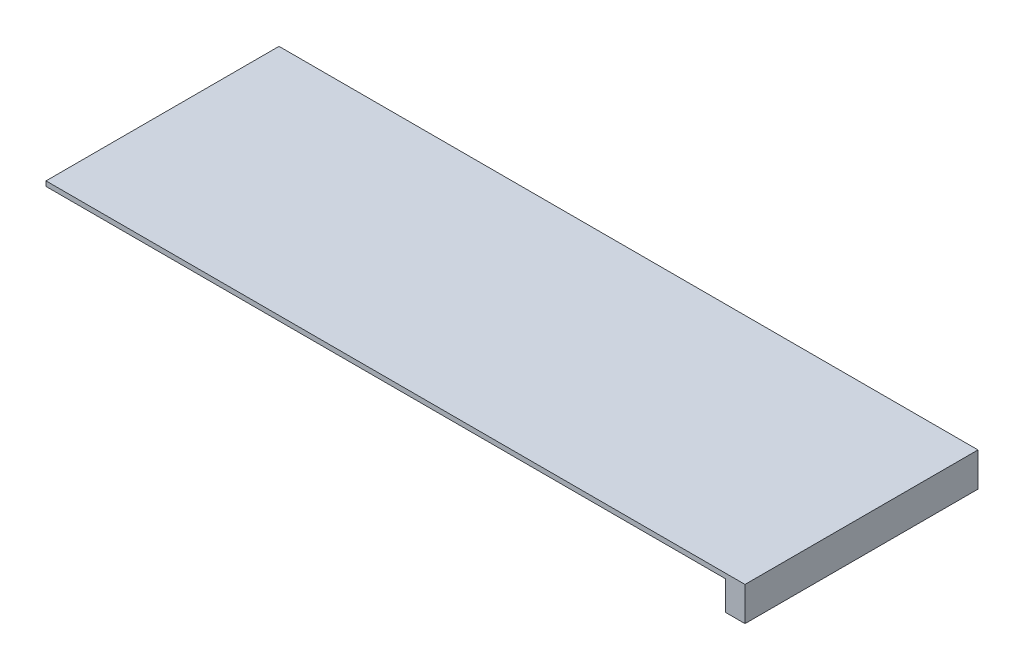
ISO-10303-21;
HEADER;
FILE_DESCRIPTION(('STEP AP214'),'2;1');
FILE_NAME('part.step','',(''),(''),'','','');
FILE_SCHEMA(('AUTOMOTIVE_DESIGN { 1 0 10303 214 1 1 1 1 }'));
ENDSEC;
DATA;
#1=APPLICATION_CONTEXT('core data for automotive mechanical design processes');
#2=APPLICATION_PROTOCOL_DEFINITION('international standard','automotive_design',2000,#1);
#3=PRODUCT_CONTEXT('',#1,'mechanical');
#4=PRODUCT('Part','Part','',(#3));
#5=PRODUCT_RELATED_PRODUCT_CATEGORY('part','',(#4));
#6=PRODUCT_DEFINITION_FORMATION('','',#4);
#7=PRODUCT_DEFINITION_CONTEXT('part definition',#1,'design');
#8=PRODUCT_DEFINITION('design','',#6,#7);
#9=PRODUCT_DEFINITION_SHAPE('','',#8);
#10=(LENGTH_UNIT() NAMED_UNIT(*) SI_UNIT(.MILLI.,.METRE.));
#11=(NAMED_UNIT(*) PLANE_ANGLE_UNIT() SI_UNIT($,.RADIAN.));
#12=(NAMED_UNIT(*) SI_UNIT($,.STERADIAN.) SOLID_ANGLE_UNIT());
#13=UNCERTAINTY_MEASURE_WITH_UNIT(LENGTH_MEASURE(1.E-05),#10,'distance_accuracy_value','');
#14=(GEOMETRIC_REPRESENTATION_CONTEXT(3) GLOBAL_UNCERTAINTY_ASSIGNED_CONTEXT((#13)) GLOBAL_UNIT_ASSIGNED_CONTEXT((#10,
#11,#12)) REPRESENTATION_CONTEXT('',''));
#15=CARTESIAN_POINT('',(0.,0.,0.));
#16=DIRECTION('',(0.,0.,1.));
#17=DIRECTION('',(1.,0.,0.));
#18=AXIS2_PLACEMENT_3D('',#15,#16,#17);
#19=CARTESIAN_POINT('',(-12.7,-19.05,0.));
#20=DIRECTION('',(1.,0.,0.));
#21=DIRECTION('',(0.,0.,-1.));
#22=AXIS2_PLACEMENT_3D('',#19,#20,#21);
#23=PLANE('',#22);
#24=DIRECTION('',(0.,-1.,0.));
#25=VECTOR('',#24,1.);
#26=CARTESIAN_POINT('',(-12.7,6.35,-19.05));
#27=LINE('',#26,#25);
#28=CARTESIAN_POINT('',(-12.7,0.,-19.05));
#29=VERTEX_POINT('',#28);
#30=CARTESIAN_POINT('',(-12.7,-19.05,-19.05));
#31=VERTEX_POINT('',#30);
#32=EDGE_CURVE('E124',#29,#31,#27,.T.);
#33=ORIENTED_EDGE('',*,*,#32,.F.);
#34=DIRECTION('',(0.,0.,1.));
#35=VECTOR('',#34,1.);
#36=CARTESIAN_POINT('',(-12.7,0.,38.0999999999999));
#37=LINE('',#36,#35);
#38=CARTESIAN_POINT('',(-12.7,0.,38.0999999999999));
#39=VERTEX_POINT('',#38);
#40=EDGE_CURVE('E205',#29,#39,#37,.T.);
#41=ORIENTED_EDGE('',*,*,#40,.T.);
#42=DIRECTION('',(0.,-1.,0.));
#43=VECTOR('',#42,1.);
#44=CARTESIAN_POINT('',(-12.7,3.175,38.0999999999999));
#45=LINE('',#44,#43);
#46=CARTESIAN_POINT('',(-12.7,3.175,38.0999999999999));
#47=VERTEX_POINT('',#46);
#48=EDGE_CURVE('E194',#47,#39,#45,.T.);
#49=ORIENTED_EDGE('',*,*,#48,.F.);
#50=DIRECTION('',(0.,0.,1.));
#51=VECTOR('',#50,1.);
#52=CARTESIAN_POINT('',(-12.7,3.175,38.0999999999999));
#53=LINE('',#52,#51);
#54=CARTESIAN_POINT('',(-12.7,3.175,-114.3));
#55=VERTEX_POINT('',#54);
#56=EDGE_CURVE('E192',#55,#47,#53,.T.);
#57=ORIENTED_EDGE('',*,*,#56,.F.);
#58=DIRECTION('',(0.,1.,0.));
#59=VECTOR('',#58,1.);
#60=CARTESIAN_POINT('',(-12.7,-19.05,-114.3));
#61=LINE('',#60,#59);
#62=CARTESIAN_POINT('',(-12.7,-19.05,-114.3));
#63=VERTEX_POINT('',#62);
#64=EDGE_CURVE('E131',#63,#55,#61,.T.);
#65=ORIENTED_EDGE('',*,*,#64,.F.);
#66=DIRECTION('',(0.,0.,-1.));
#67=VECTOR('',#66,1.);
#68=CARTESIAN_POINT('',(-12.7,-19.05,0.));
#69=LINE('',#68,#67);
#70=EDGE_CURVE('E80',#31,#63,#69,.T.);
#71=ORIENTED_EDGE('',*,*,#70,.F.);
#72=EDGE_LOOP('',(#33,#41,#49,#57,#65,#71));
#73=FACE_BOUND('',#72,.T.);
#74=ADVANCED_FACE('F36',(#73),#23,.F.);
#75=CARTESIAN_POINT('',(0.,-19.05,0.));
#76=DIRECTION('',(0.,-1.,0.));
#77=DIRECTION('',(0.,0.,-1.));
#78=AXIS2_PLACEMENT_3D('',#75,#76,#77);
#79=PLANE('',#78);
#80=DIRECTION('',(1.,0.,0.));
#81=VECTOR('',#80,1.);
#82=CARTESIAN_POINT('',(0.,-19.05,-19.05));
#83=LINE('',#82,#81);
#84=CARTESIAN_POINT('',(57.15,-19.05,-19.05));
#85=VERTEX_POINT('',#84);
#86=EDGE_CURVE('E116',#31,#85,#83,.T.);
#87=ORIENTED_EDGE('',*,*,#86,.F.);
#88=ORIENTED_EDGE('',*,*,#70,.T.);
#89=DIRECTION('',(1.,0.,0.));
#90=VECTOR('',#89,1.);
#91=CARTESIAN_POINT('',(0.,-19.05,-114.3));
#92=LINE('',#91,#90);
#93=CARTESIAN_POINT('',(444.5,-19.05,-114.3));
#94=VERTEX_POINT('',#93);
#95=EDGE_CURVE('E164',#63,#94,#92,.T.);
#96=ORIENTED_EDGE('',*,*,#95,.T.);
#97=DIRECTION('',(0.,0.,1.));
#98=VECTOR('',#97,1.);
#99=CARTESIAN_POINT('',(444.5,-19.05,0.));
#100=LINE('',#99,#98);
#101=CARTESIAN_POINT('',(444.5,-19.05,38.0999999999999));
#102=VERTEX_POINT('',#101);
#103=EDGE_CURVE('E111',#94,#102,#100,.T.);
#104=ORIENTED_EDGE('',*,*,#103,.T.);
#105=DIRECTION('',(1.,0.,0.));
#106=VECTOR('',#105,1.);
#107=CARTESIAN_POINT('',(0.,-19.05,38.0999999999999));
#108=LINE('',#107,#106);
#109=CARTESIAN_POINT('',(431.8,-19.05,38.0999999999999));
#110=VERTEX_POINT('',#109);
#111=EDGE_CURVE('E150',#110,#102,#108,.T.);
#112=ORIENTED_EDGE('',*,*,#111,.F.);
#113=DIRECTION('',(0.,0.,1.));
#114=VECTOR('',#113,1.);
#115=CARTESIAN_POINT('',(431.8,-19.05,0.));
#116=LINE('',#115,#114);
#117=CARTESIAN_POINT('',(431.8,-19.05,12.6999999999999));
#118=VERTEX_POINT('',#117);
#119=EDGE_CURVE('E110',#118,#110,#116,.T.);
#120=ORIENTED_EDGE('',*,*,#119,.F.);
#121=DIRECTION('',(0.786318338822423,0.,0.617821551931904));
#122=VECTOR('',#121,1.);
#123=CARTESIAN_POINT('',(158.649842271293,-19.05,-201.917981072555));
#124=LINE('',#123,#122);
#125=CARTESIAN_POINT('',(342.9,-19.05,-57.15));
#126=VERTEX_POINT('',#125);
#127=EDGE_CURVE('E97',#126,#118,#124,.T.);
#128=ORIENTED_EDGE('',*,*,#127,.F.);
#129=DIRECTION('',(1.,0.,0.));
#130=VECTOR('',#129,1.);
#131=CARTESIAN_POINT('',(0.,-19.05,-57.15));
#132=LINE('',#131,#130);
#133=CARTESIAN_POINT('',(88.9,-19.05,-57.15));
#134=VERTEX_POINT('',#133);
#135=EDGE_CURVE('E107',#134,#126,#132,.T.);
#136=ORIENTED_EDGE('',*,*,#135,.F.);
#137=DIRECTION('',(0.64018439966448,0.,-0.768221279597376));
#138=VECTOR('',#137,1.);
#139=CARTESIAN_POINT('',(24.3590163934426,-19.05,20.2991803278689));
#140=LINE('',#139,#138);
#141=EDGE_CURVE('E114',#85,#134,#140,.T.);
#142=ORIENTED_EDGE('',*,*,#141,.F.);
#143=EDGE_LOOP('',(#87,#88,#96,#104,#112,#120,#128,#136,#142));
#144=FACE_BOUND('',#143,.T.);
#145=ADVANCED_FACE('F106',(#144),#79,.T.);
#146=CARTESIAN_POINT('',(158.649842271293,-19.05,-201.917981072555));
#147=DIRECTION('',(-0.617821551931903,0.,0.786318338822423));
#148=DIRECTION('',(0.786318338822423,0.,0.617821551931904));
#149=AXIS2_PLACEMENT_3D('',#146,#147,#148);
#150=PLANE('',#149);
#151=DIRECTION('',(0.786318338822423,0.,0.617821551931904));
#152=VECTOR('',#151,1.);
#153=CARTESIAN_POINT('',(158.649842271293,0.,-201.917981072555));
#154=LINE('',#153,#152);
#155=CARTESIAN_POINT('',(342.9,0.,-57.15));
#156=VERTEX_POINT('',#155);
#157=CARTESIAN_POINT('',(431.8,0.,12.6999999999999));
#158=VERTEX_POINT('',#157);
#159=EDGE_CURVE('E99',#156,#158,#154,.T.);
#160=ORIENTED_EDGE('',*,*,#159,.F.);
#161=DIRECTION('',(0.,1.,0.));
#162=VECTOR('',#161,1.);
#163=CARTESIAN_POINT('',(342.9,-19.05,-57.15));
#164=LINE('',#163,#162);
#165=EDGE_CURVE('E92',#126,#156,#164,.T.);
#166=ORIENTED_EDGE('',*,*,#165,.F.);
#167=ORIENTED_EDGE('',*,*,#127,.T.);
#168=DIRECTION('',(0.,1.,0.));
#169=VECTOR('',#168,1.);
#170=CARTESIAN_POINT('',(431.8,-19.05,12.7));
#171=LINE('',#170,#169);
#172=EDGE_CURVE('E46',#118,#158,#171,.T.);
#173=ORIENTED_EDGE('',*,*,#172,.T.);
#174=EDGE_LOOP('',(#160,#166,#167,#173));
#175=FACE_BOUND('',#174,.T.);
#176=ADVANCED_FACE('F94',(#175),#150,.T.);
#177=CARTESIAN_POINT('',(0.,-19.05,-57.15));
#178=DIRECTION('',(0.,0.,1.));
#179=DIRECTION('',(1.,0.,0.));
#180=AXIS2_PLACEMENT_3D('',#177,#178,#179);
#181=PLANE('',#180);
#182=DIRECTION('',(1.,0.,0.));
#183=VECTOR('',#182,1.);
#184=CARTESIAN_POINT('',(0.,0.,-57.15));
#185=LINE('',#184,#183);
#186=CARTESIAN_POINT('',(88.9,0.,-57.15));
#187=VERTEX_POINT('',#186);
#188=EDGE_CURVE('E123',#187,#156,#185,.T.);
#189=ORIENTED_EDGE('',*,*,#188,.F.);
#190=DIRECTION('',(0.,1.,0.));
#191=VECTOR('',#190,1.);
#192=CARTESIAN_POINT('',(88.9,-19.05,-57.15));
#193=LINE('',#192,#191);
#194=EDGE_CURVE('E67',#134,#187,#193,.T.);
#195=ORIENTED_EDGE('',*,*,#194,.F.);
#196=ORIENTED_EDGE('',*,*,#135,.T.);
#197=ORIENTED_EDGE('',*,*,#165,.T.);
#198=EDGE_LOOP('',(#189,#195,#196,#197));
#199=FACE_BOUND('',#198,.T.);
#200=ADVANCED_FACE('F113',(#199),#181,.T.);
#201=CARTESIAN_POINT('',(24.3590163934426,-19.05,20.2991803278689));
#202=DIRECTION('',(0.768221279597376,0.,0.64018439966448));
#203=DIRECTION('',(0.64018439966448,0.,-0.768221279597376));
#204=AXIS2_PLACEMENT_3D('',#201,#202,#203);
#205=PLANE('',#204);
#206=DIRECTION('',(0.64018439966448,0.,-0.768221279597376));
#207=VECTOR('',#206,1.);
#208=CARTESIAN_POINT('',(24.3590163934426,0.,20.2991803278689));
#209=LINE('',#208,#207);
#210=CARTESIAN_POINT('',(57.15,0.,-19.05));
#211=VERTEX_POINT('',#210);
#212=EDGE_CURVE('E126',#211,#187,#209,.T.);
#213=ORIENTED_EDGE('',*,*,#212,.F.);
#214=DIRECTION('',(0.,1.,0.));
#215=VECTOR('',#214,1.);
#216=CARTESIAN_POINT('',(57.15,-19.05,-19.05));
#217=LINE('',#216,#215);
#218=EDGE_CURVE('E55',#85,#211,#217,.T.);
#219=ORIENTED_EDGE('',*,*,#218,.F.);
#220=ORIENTED_EDGE('',*,*,#141,.T.);
#221=ORIENTED_EDGE('',*,*,#194,.T.);
#222=EDGE_LOOP('',(#213,#219,#220,#221));
#223=FACE_BOUND('',#222,.T.);
#224=ADVANCED_FACE('F229',(#223),#205,.T.);
#225=CARTESIAN_POINT('',(0.,-19.05,-19.05));
#226=DIRECTION('',(0.,0.,1.));
#227=DIRECTION('',(1.,0.,0.));
#228=AXIS2_PLACEMENT_3D('',#225,#226,#227);
#229=PLANE('',#228);
#230=DIRECTION('',(1.,0.,0.));
#231=VECTOR('',#230,1.);
#232=CARTESIAN_POINT('',(0.,0.,-19.05));
#233=LINE('',#232,#231);
#234=EDGE_CURVE('E129',#29,#211,#233,.T.);
#235=ORIENTED_EDGE('',*,*,#234,.F.);
#236=ORIENTED_EDGE('',*,*,#32,.T.);
#237=ORIENTED_EDGE('',*,*,#86,.T.);
#238=ORIENTED_EDGE('',*,*,#218,.T.);
#239=EDGE_LOOP('',(#235,#236,#237,#238));
#240=FACE_BOUND('',#239,.T.);
#241=ADVANCED_FACE('F155',(#240),#229,.T.);
#242=CARTESIAN_POINT('',(0.,-19.05,38.0999999999999));
#243=DIRECTION('',(0.,0.,1.));
#244=DIRECTION('',(1.,0.,0.));
#245=AXIS2_PLACEMENT_3D('',#242,#243,#244);
#246=PLANE('',#245);
#247=DIRECTION('',(0.,-1.,0.));
#248=VECTOR('',#247,1.);
#249=CARTESIAN_POINT('',(431.8,6.35,38.0999999999999));
#250=LINE('',#249,#248);
#251=CARTESIAN_POINT('',(431.8,0.,38.0999999999999));
#252=VERTEX_POINT('',#251);
#253=EDGE_CURVE('E143',#252,#110,#250,.T.);
#254=ORIENTED_EDGE('',*,*,#253,.T.);
#255=ORIENTED_EDGE('',*,*,#111,.T.);
#256=DIRECTION('',(0.,1.,0.));
#257=VECTOR('',#256,1.);
#258=CARTESIAN_POINT('',(444.5,-19.05,38.0999999999999));
#259=LINE('',#258,#257);
#260=CARTESIAN_POINT('',(444.5,3.175,38.0999999999999));
#261=VERTEX_POINT('',#260);
#262=EDGE_CURVE('E121',#102,#261,#259,.T.);
#263=ORIENTED_EDGE('',*,*,#262,.T.);
#264=DIRECTION('',(1.,0.,0.));
#265=VECTOR('',#264,1.);
#266=CARTESIAN_POINT('',(444.5,3.175,38.0999999999999));
#267=LINE('',#266,#265);
#268=EDGE_CURVE('E184',#47,#261,#267,.T.);
#269=ORIENTED_EDGE('',*,*,#268,.F.);
#270=ORIENTED_EDGE('',*,*,#48,.T.);
#271=DIRECTION('',(1.,0.,0.));
#272=VECTOR('',#271,1.);
#273=CARTESIAN_POINT('',(444.5,0.,38.0999999999999));
#274=LINE('',#273,#272);
#275=EDGE_CURVE('E207',#39,#252,#274,.T.);
#276=ORIENTED_EDGE('',*,*,#275,.T.);
#277=EDGE_LOOP('',(#254,#255,#263,#269,#270,#276));
#278=FACE_BOUND('',#277,.T.);
#279=ADVANCED_FACE('F38',(#278),#246,.T.);
#280=CARTESIAN_POINT('',(0.,-19.05,-114.3));
#281=DIRECTION('',(0.,0.,1.));
#282=DIRECTION('',(1.,0.,0.));
#283=AXIS2_PLACEMENT_3D('',#280,#281,#282);
#284=PLANE('',#283);
#285=ORIENTED_EDGE('',*,*,#64,.T.);
#286=DIRECTION('',(-1.,0.,0.));
#287=VECTOR('',#286,1.);
#288=CARTESIAN_POINT('',(444.5,3.175,-114.3));
#289=LINE('',#288,#287);
#290=CARTESIAN_POINT('',(444.5,3.175,-114.3));
#291=VERTEX_POINT('',#290);
#292=EDGE_CURVE('E197',#291,#55,#289,.T.);
#293=ORIENTED_EDGE('',*,*,#292,.F.);
#294=DIRECTION('',(0.,1.,0.));
#295=VECTOR('',#294,1.);
#296=CARTESIAN_POINT('',(444.5,-19.05,-114.3));
#297=LINE('',#296,#295);
#298=EDGE_CURVE('E136',#94,#291,#297,.T.);
#299=ORIENTED_EDGE('',*,*,#298,.F.);
#300=ORIENTED_EDGE('',*,*,#95,.F.);
#301=EDGE_LOOP('',(#285,#293,#299,#300));
#302=FACE_BOUND('',#301,.T.);
#303=ADVANCED_FACE('F244',(#302),#284,.F.);
#304=CARTESIAN_POINT('',(444.5,-19.05,0.));
#305=DIRECTION('',(-1.,0.,0.));
#306=DIRECTION('',(0.,0.,1.));
#307=AXIS2_PLACEMENT_3D('',#304,#305,#306);
#308=PLANE('',#307);
#309=ORIENTED_EDGE('',*,*,#298,.T.);
#310=DIRECTION('',(0.,0.,-1.));
#311=VECTOR('',#310,1.);
#312=CARTESIAN_POINT('',(444.5,3.175,38.0999999999999));
#313=LINE('',#312,#311);
#314=EDGE_CURVE('E178',#261,#291,#313,.T.);
#315=ORIENTED_EDGE('',*,*,#314,.F.);
#316=ORIENTED_EDGE('',*,*,#262,.F.);
#317=ORIENTED_EDGE('',*,*,#103,.F.);
#318=EDGE_LOOP('',(#309,#315,#316,#317));
#319=FACE_BOUND('',#318,.T.);
#320=ADVANCED_FACE('F175',(#319),#308,.F.);
#321=CARTESIAN_POINT('',(431.8,6.35,0.));
#322=DIRECTION('',(1.,0.,0.));
#323=DIRECTION('',(0.,0.,-1.));
#324=AXIS2_PLACEMENT_3D('',#321,#322,#323);
#325=PLANE('',#324);
#326=ORIENTED_EDGE('',*,*,#172,.F.);
#327=ORIENTED_EDGE('',*,*,#119,.T.);
#328=ORIENTED_EDGE('',*,*,#253,.F.);
#329=DIRECTION('',(0.,0.,1.));
#330=VECTOR('',#329,1.);
#331=CARTESIAN_POINT('',(431.8,0.,0.));
#332=LINE('',#331,#330);
#333=EDGE_CURVE('E12',#158,#252,#332,.T.);
#334=ORIENTED_EDGE('',*,*,#333,.F.);
#335=EDGE_LOOP('',(#326,#327,#328,#334));
#336=FACE_BOUND('',#335,.T.);
#337=ADVANCED_FACE('F211',(#336),#325,.F.);
#338=CARTESIAN_POINT('',(0.,0.,0.));
#339=DIRECTION('',(0.,1.,0.));
#340=DIRECTION('',(0.,0.,1.));
#341=AXIS2_PLACEMENT_3D('',#338,#339,#340);
#342=PLANE('',#341);
#343=ORIENTED_EDGE('',*,*,#40,.F.);
#344=ORIENTED_EDGE('',*,*,#234,.T.);
#345=ORIENTED_EDGE('',*,*,#212,.T.);
#346=ORIENTED_EDGE('',*,*,#188,.T.);
#347=ORIENTED_EDGE('',*,*,#159,.T.);
#348=ORIENTED_EDGE('',*,*,#333,.T.);
#349=ORIENTED_EDGE('',*,*,#275,.F.);
#350=EDGE_LOOP('',(#343,#344,#345,#346,#347,#348,#349));
#351=FACE_BOUND('',#350,.T.);
#352=ADVANCED_FACE('F228',(#351),#342,.F.);
#353=CARTESIAN_POINT('',(0.,3.175,0.));
#354=DIRECTION('',(0.,1.,0.));
#355=DIRECTION('',(0.,0.,1.));
#356=AXIS2_PLACEMENT_3D('',#353,#354,#355);
#357=PLANE('',#356);
#358=ORIENTED_EDGE('',*,*,#314,.T.);
#359=ORIENTED_EDGE('',*,*,#292,.T.);
#360=ORIENTED_EDGE('',*,*,#56,.T.);
#361=ORIENTED_EDGE('',*,*,#268,.T.);
#362=EDGE_LOOP('',(#358,#359,#360,#361));
#363=FACE_BOUND('',#362,.T.);
#364=ADVANCED_FACE('F189',(#363),#357,.T.);
#365=CLOSED_SHELL('',(#74,#145,#176,#200,#224,#241,#279,#303,#320,#337,#352,#364));
#366=MANIFOLD_SOLID_BREP('B2',#365);
#367=ADVANCED_BREP_SHAPE_REPRESENTATION('',(#18,#366),#14);
#368=SHAPE_DEFINITION_REPRESENTATION(#9,#367);
ENDSEC;
END-ISO-10303-21;
